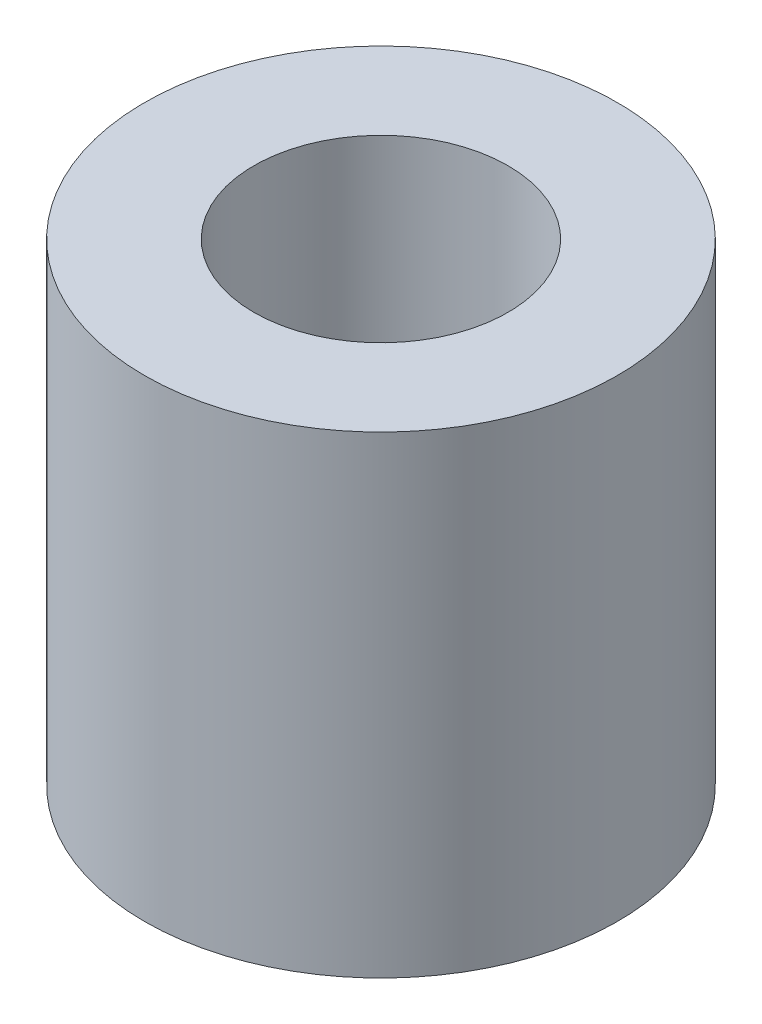
ISO-10303-21;
HEADER;
FILE_DESCRIPTION(('STEP AP214'),'2;1');
FILE_NAME('part.step','',(''),(''),'','','');
FILE_SCHEMA(('AUTOMOTIVE_DESIGN { 1 0 10303 214 1 1 1 1 }'));
ENDSEC;
DATA;
#1=APPLICATION_CONTEXT('core data for automotive mechanical design processes');
#2=APPLICATION_PROTOCOL_DEFINITION('international standard','automotive_design',2000,#1);
#3=PRODUCT_CONTEXT('',#1,'mechanical');
#4=PRODUCT('Part','Part','',(#3));
#5=PRODUCT_RELATED_PRODUCT_CATEGORY('part','',(#4));
#6=PRODUCT_DEFINITION_FORMATION('','',#4);
#7=PRODUCT_DEFINITION_CONTEXT('part definition',#1,'design');
#8=PRODUCT_DEFINITION('design','',#6,#7);
#9=PRODUCT_DEFINITION_SHAPE('','',#8);
#10=(LENGTH_UNIT() NAMED_UNIT(*) SI_UNIT(.MILLI.,.METRE.));
#11=(NAMED_UNIT(*) PLANE_ANGLE_UNIT() SI_UNIT($,.RADIAN.));
#12=(NAMED_UNIT(*) SI_UNIT($,.STERADIAN.) SOLID_ANGLE_UNIT());
#13=UNCERTAINTY_MEASURE_WITH_UNIT(LENGTH_MEASURE(1.E-05),#10,'distance_accuracy_value','');
#14=(GEOMETRIC_REPRESENTATION_CONTEXT(3) GLOBAL_UNCERTAINTY_ASSIGNED_CONTEXT((#13)) GLOBAL_UNIT_ASSIGNED_CONTEXT((#10,
#11,#12)) REPRESENTATION_CONTEXT('',''));
#15=CARTESIAN_POINT('',(0.,0.,0.));
#16=DIRECTION('',(0.,0.,1.));
#17=DIRECTION('',(1.,0.,0.));
#18=AXIS2_PLACEMENT_3D('',#15,#16,#17);
#19=CARTESIAN_POINT('',(40.,4.,195.45));
#20=DIRECTION('',(0.,-1.,0.));
#21=DIRECTION('',(0.,0.,-1.));
#22=AXIS2_PLACEMENT_3D('',#19,#20,#21);
#23=CYLINDRICAL_SURFACE('',#22,4.);
#24=CARTESIAN_POINT('',(40.,4.,195.45));
#25=DIRECTION('',(0.,1.,0.));
#26=DIRECTION('',(0.,0.,1.));
#27=AXIS2_PLACEMENT_3D('',#24,#25,#26);
#28=CIRCLE('',#27,4.);
#29=CARTESIAN_POINT('',(40.,4.,199.45));
#30=VERTEX_POINT('',#29);
#31=EDGE_CURVE('E10',#30,#30,#28,.T.);
#32=ORIENTED_EDGE('',*,*,#31,.F.);
#33=EDGE_LOOP('',(#32));
#34=FACE_BOUND('',#33,.T.);
#35=CARTESIAN_POINT('',(40.,-4.,195.45));
#36=DIRECTION('',(0.,1.,0.));
#37=DIRECTION('',(0.,0.,1.));
#38=AXIS2_PLACEMENT_3D('',#35,#36,#37);
#39=CIRCLE('',#38,4.);
#40=CARTESIAN_POINT('',(40.,-4.,199.45));
#41=VERTEX_POINT('',#40);
#42=EDGE_CURVE('E46',#41,#41,#39,.T.);
#43=ORIENTED_EDGE('',*,*,#42,.T.);
#44=EDGE_LOOP('',(#43));
#45=FACE_BOUND('',#44,.T.);
#46=ADVANCED_FACE('F43',(#34,#45),#23,.T.);
#47=CARTESIAN_POINT('',(40.,4.,195.45));
#48=DIRECTION('',(0.,1.,0.));
#49=DIRECTION('',(0.,0.,1.));
#50=AXIS2_PLACEMENT_3D('',#47,#48,#49);
#51=PLANE('',#50);
#52=CARTESIAN_POINT('',(40.,4.,195.45));
#53=DIRECTION('',(0.,1.,0.));
#54=DIRECTION('',(0.,0.,1.));
#55=AXIS2_PLACEMENT_3D('',#52,#53,#54);
#56=CIRCLE('',#55,2.15);
#57=CARTESIAN_POINT('',(40.,4.,197.6));
#58=VERTEX_POINT('',#57);
#59=EDGE_CURVE('E54',#58,#58,#56,.T.);
#60=ORIENTED_EDGE('',*,*,#59,.F.);
#61=EDGE_LOOP('',(#60));
#62=FACE_BOUND('',#61,.T.);
#63=ORIENTED_EDGE('',*,*,#31,.T.);
#64=EDGE_LOOP('',(#63));
#65=FACE_BOUND('',#64,.T.);
#66=ADVANCED_FACE('F70',(#62,#65),#51,.T.);
#67=CARTESIAN_POINT('',(40.,-4.,195.45));
#68=DIRECTION('',(0.,1.,0.));
#69=DIRECTION('',(0.,0.,1.));
#70=AXIS2_PLACEMENT_3D('',#67,#68,#69);
#71=PLANE('',#70);
#72=CARTESIAN_POINT('',(40.,-4.,195.45));
#73=DIRECTION('',(0.,1.,0.));
#74=DIRECTION('',(0.,0.,1.));
#75=AXIS2_PLACEMENT_3D('',#72,#73,#74);
#76=CIRCLE('',#75,2.15);
#77=CARTESIAN_POINT('',(40.,-4.,197.6));
#78=VERTEX_POINT('',#77);
#79=EDGE_CURVE('E60',#78,#78,#76,.T.);
#80=ORIENTED_EDGE('',*,*,#79,.T.);
#81=EDGE_LOOP('',(#80));
#82=FACE_BOUND('',#81,.T.);
#83=ORIENTED_EDGE('',*,*,#42,.F.);
#84=EDGE_LOOP('',(#83));
#85=FACE_BOUND('',#84,.T.);
#86=ADVANCED_FACE('F68',(#82,#85),#71,.F.);
#87=CARTESIAN_POINT('',(40.,4.,195.45));
#88=DIRECTION('',(0.,-1.,0.));
#89=DIRECTION('',(0.,0.,-1.));
#90=AXIS2_PLACEMENT_3D('',#87,#88,#89);
#91=CYLINDRICAL_SURFACE('',#90,2.15);
#92=ORIENTED_EDGE('',*,*,#59,.T.);
#93=EDGE_LOOP('',(#92));
#94=FACE_BOUND('',#93,.T.);
#95=ORIENTED_EDGE('',*,*,#79,.F.);
#96=EDGE_LOOP('',(#95));
#97=FACE_BOUND('',#96,.T.);
#98=ADVANCED_FACE('F62',(#94,#97),#91,.F.);
#99=CLOSED_SHELL('',(#46,#66,#86,#98));
#100=MANIFOLD_SOLID_BREP('B2',#99);
#101=ADVANCED_BREP_SHAPE_REPRESENTATION('',(#18,#100),#14);
#102=SHAPE_DEFINITION_REPRESENTATION(#9,#101);
ENDSEC;
END-ISO-10303-21;
